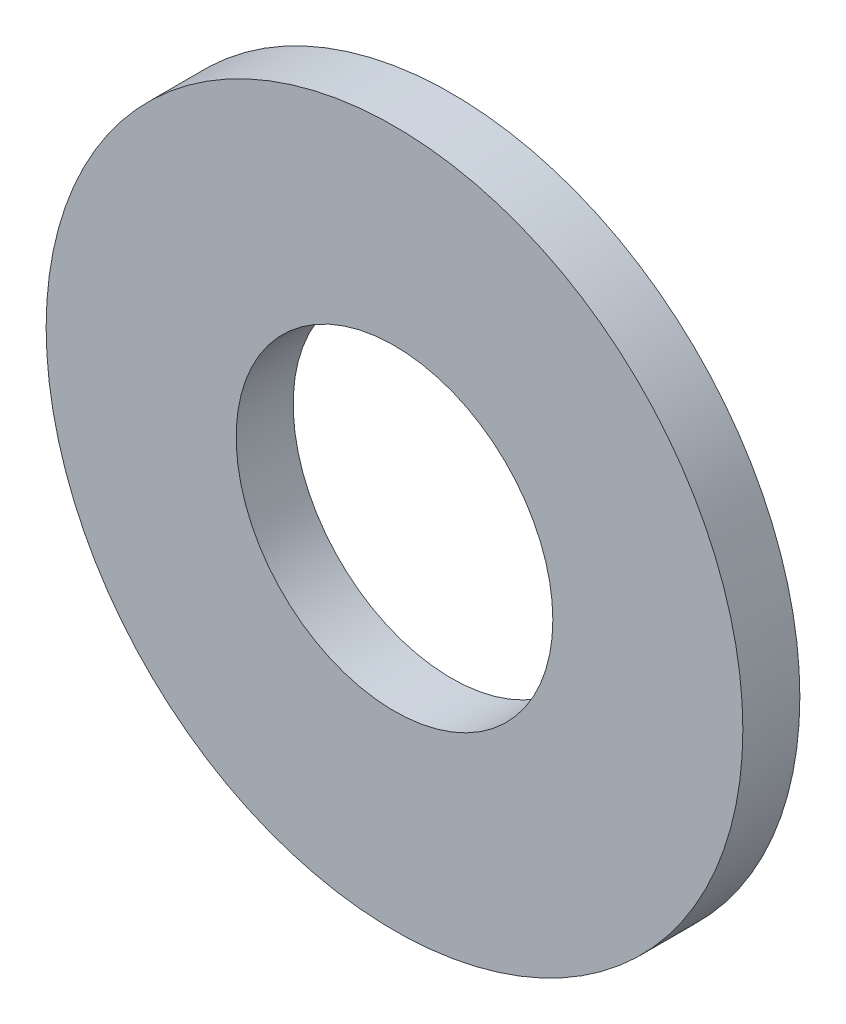
ISO-10303-21;
HEADER;
FILE_DESCRIPTION(('STEP AP214'),'2;1');
FILE_NAME('part.step','',(''),(''),'','','');
FILE_SCHEMA(('AUTOMOTIVE_DESIGN { 1 0 10303 214 1 1 1 1 }'));
ENDSEC;
DATA;
#1=APPLICATION_CONTEXT('core data for automotive mechanical design processes');
#2=APPLICATION_PROTOCOL_DEFINITION('international standard','automotive_design',2000,#1);
#3=PRODUCT_CONTEXT('',#1,'mechanical');
#4=PRODUCT('Part','Part','',(#3));
#5=PRODUCT_RELATED_PRODUCT_CATEGORY('part','',(#4));
#6=PRODUCT_DEFINITION_FORMATION('','',#4);
#7=PRODUCT_DEFINITION_CONTEXT('part definition',#1,'design');
#8=PRODUCT_DEFINITION('design','',#6,#7);
#9=PRODUCT_DEFINITION_SHAPE('','',#8);
#10=(LENGTH_UNIT() NAMED_UNIT(*) SI_UNIT(.MILLI.,.METRE.));
#11=(NAMED_UNIT(*) PLANE_ANGLE_UNIT() SI_UNIT($,.RADIAN.));
#12=(NAMED_UNIT(*) SI_UNIT($,.STERADIAN.) SOLID_ANGLE_UNIT());
#13=UNCERTAINTY_MEASURE_WITH_UNIT(LENGTH_MEASURE(1.E-05),#10,'distance_accuracy_value','');
#14=(GEOMETRIC_REPRESENTATION_CONTEXT(3) GLOBAL_UNCERTAINTY_ASSIGNED_CONTEXT((#13)) GLOBAL_UNIT_ASSIGNED_CONTEXT((#10,
#11,#12)) REPRESENTATION_CONTEXT('',''));
#15=CARTESIAN_POINT('',(0.,0.,0.));
#16=DIRECTION('',(0.,0.,1.));
#17=DIRECTION('',(1.,0.,0.));
#18=AXIS2_PLACEMENT_3D('',#15,#16,#17);
#19=CARTESIAN_POINT('',(0.,0.,1.8));
#20=DIRECTION('',(0.,0.,1.));
#21=DIRECTION('',(1.,0.,0.));
#22=AXIS2_PLACEMENT_3D('',#19,#20,#21);
#23=PLANE('',#22);
#24=CARTESIAN_POINT('',(0.,0.,1.8));
#25=DIRECTION('',(0.,0.,1.));
#26=DIRECTION('',(1.,0.,0.));
#27=AXIS2_PLACEMENT_3D('',#24,#25,#26);
#28=CIRCLE('',#27,11.);
#29=CARTESIAN_POINT('',(11.,0.,1.8));
#30=VERTEX_POINT('',#29);
#31=EDGE_CURVE('E10',#30,#30,#28,.T.);
#32=ORIENTED_EDGE('',*,*,#31,.T.);
#33=EDGE_LOOP('',(#32));
#34=FACE_BOUND('',#33,.T.);
#35=CARTESIAN_POINT('',(0.,0.,1.8));
#36=DIRECTION('',(0.,0.,1.));
#37=DIRECTION('',(1.,0.,0.));
#38=AXIS2_PLACEMENT_3D('',#35,#36,#37);
#39=CIRCLE('',#38,5.);
#40=CARTESIAN_POINT('',(5.,0.,1.8));
#41=VERTEX_POINT('',#40);
#42=EDGE_CURVE('E41',#41,#41,#39,.T.);
#43=ORIENTED_EDGE('',*,*,#42,.F.);
#44=EDGE_LOOP('',(#43));
#45=FACE_BOUND('',#44,.T.);
#46=ADVANCED_FACE('F30',(#34,#45),#23,.T.);
#47=CARTESIAN_POINT('',(0.,0.,0.));
#48=DIRECTION('',(0.,0.,1.));
#49=DIRECTION('',(1.,0.,0.));
#50=AXIS2_PLACEMENT_3D('',#47,#48,#49);
#51=PLANE('',#50);
#52=CARTESIAN_POINT('',(0.,0.,0.));
#53=DIRECTION('',(0.,0.,1.));
#54=DIRECTION('',(1.,0.,0.));
#55=AXIS2_PLACEMENT_3D('',#52,#53,#54);
#56=CIRCLE('',#55,11.);
#57=CARTESIAN_POINT('',(11.,0.,0.));
#58=VERTEX_POINT('',#57);
#59=EDGE_CURVE('E34',#58,#58,#56,.T.);
#60=ORIENTED_EDGE('',*,*,#59,.F.);
#61=EDGE_LOOP('',(#60));
#62=FACE_BOUND('',#61,.T.);
#63=CARTESIAN_POINT('',(0.,0.,0.));
#64=DIRECTION('',(0.,0.,1.));
#65=DIRECTION('',(1.,0.,0.));
#66=AXIS2_PLACEMENT_3D('',#63,#64,#65);
#67=CIRCLE('',#66,5.);
#68=CARTESIAN_POINT('',(5.,0.,0.));
#69=VERTEX_POINT('',#68);
#70=EDGE_CURVE('E43',#69,#69,#67,.T.);
#71=ORIENTED_EDGE('',*,*,#70,.T.);
#72=EDGE_LOOP('',(#71));
#73=FACE_BOUND('',#72,.T.);
#74=ADVANCED_FACE('F53',(#62,#73),#51,.F.);
#75=CARTESIAN_POINT('',(0.,0.,1.8));
#76=DIRECTION('',(0.,0.,-1.));
#77=DIRECTION('',(-1.,0.,0.));
#78=AXIS2_PLACEMENT_3D('',#75,#76,#77);
#79=CYLINDRICAL_SURFACE('',#78,11.);
#80=ORIENTED_EDGE('',*,*,#31,.F.);
#81=EDGE_LOOP('',(#80));
#82=FACE_BOUND('',#81,.T.);
#83=ORIENTED_EDGE('',*,*,#59,.T.);
#84=EDGE_LOOP('',(#83));
#85=FACE_BOUND('',#84,.T.);
#86=ADVANCED_FACE('F32',(#82,#85),#79,.T.);
#87=CARTESIAN_POINT('',(0.,0.,1.8));
#88=DIRECTION('',(0.,0.,-1.));
#89=DIRECTION('',(-1.,0.,0.));
#90=AXIS2_PLACEMENT_3D('',#87,#88,#89);
#91=CYLINDRICAL_SURFACE('',#90,5.);
#92=ORIENTED_EDGE('',*,*,#42,.T.);
#93=EDGE_LOOP('',(#92));
#94=FACE_BOUND('',#93,.T.);
#95=ORIENTED_EDGE('',*,*,#70,.F.);
#96=EDGE_LOOP('',(#95));
#97=FACE_BOUND('',#96,.T.);
#98=ADVANCED_FACE('F49',(#94,#97),#91,.F.);
#99=CLOSED_SHELL('',(#46,#74,#86,#98));
#100=MANIFOLD_SOLID_BREP('B2',#99);
#101=ADVANCED_BREP_SHAPE_REPRESENTATION('',(#18,#100),#14);
#102=SHAPE_DEFINITION_REPRESENTATION(#9,#101);
ENDSEC;
END-ISO-10303-21;
